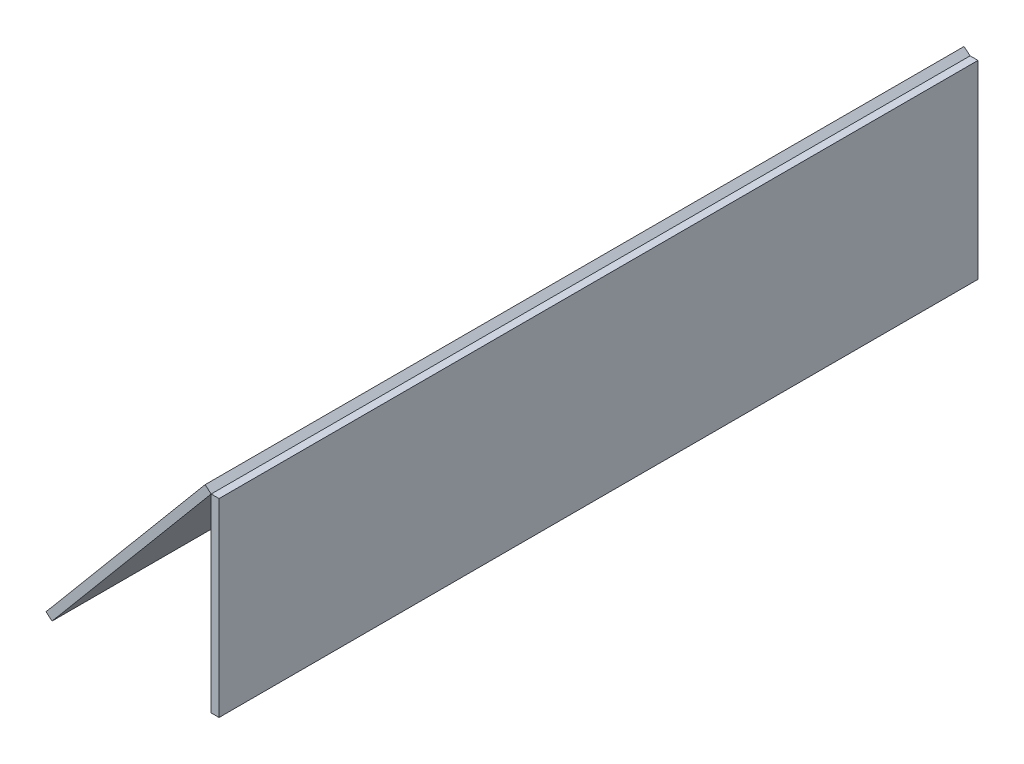
ISO-10303-21;
HEADER;
FILE_DESCRIPTION(('STEP AP214'),'2;1');
FILE_NAME('part.step','',(''),(''),'','','');
FILE_SCHEMA(('AUTOMOTIVE_DESIGN { 1 0 10303 214 1 1 1 1 }'));
ENDSEC;
DATA;
#1=APPLICATION_CONTEXT('core data for automotive mechanical design processes');
#2=APPLICATION_PROTOCOL_DEFINITION('international standard','automotive_design',2000,#1);
#3=PRODUCT_CONTEXT('',#1,'mechanical');
#4=PRODUCT('Part','Part','',(#3));
#5=PRODUCT_RELATED_PRODUCT_CATEGORY('part','',(#4));
#6=PRODUCT_DEFINITION_FORMATION('','',#4);
#7=PRODUCT_DEFINITION_CONTEXT('part definition',#1,'design');
#8=PRODUCT_DEFINITION('design','',#6,#7);
#9=PRODUCT_DEFINITION_SHAPE('','',#8);
#10=(LENGTH_UNIT() NAMED_UNIT(*) SI_UNIT(.MILLI.,.METRE.));
#11=(NAMED_UNIT(*) PLANE_ANGLE_UNIT() SI_UNIT($,.RADIAN.));
#12=(NAMED_UNIT(*) SI_UNIT($,.STERADIAN.) SOLID_ANGLE_UNIT());
#13=UNCERTAINTY_MEASURE_WITH_UNIT(LENGTH_MEASURE(1.E-05),#10,'distance_accuracy_value','');
#14=(GEOMETRIC_REPRESENTATION_CONTEXT(3) GLOBAL_UNCERTAINTY_ASSIGNED_CONTEXT((#13)) GLOBAL_UNIT_ASSIGNED_CONTEXT((#10,
#11,#12)) REPRESENTATION_CONTEXT('',''));
#15=CARTESIAN_POINT('',(0.,0.,0.));
#16=DIRECTION('',(0.,0.,1.));
#17=DIRECTION('',(1.,0.,0.));
#18=AXIS2_PLACEMENT_3D('',#15,#16,#17);
#19=CARTESIAN_POINT('',(-4.86438221380546,80.2817013215095,510.200562790563));
#20=DIRECTION('',(0.642787609686535,0.766044443118982,0.));
#21=DIRECTION('',(-0.766044443118982,0.642787609686535,0.));
#22=AXIS2_PLACEMENT_3D('',#19,#20,#21);
#23=PLANE('',#22);
#24=DIRECTION('',(-0.766044443118982,0.642787609686535,0.));
#25=VECTOR('',#24,1.);
#26=CARTESIAN_POINT('',(-4.86438221380546,80.2817013215095,305.));
#27=LINE('',#26,#25);
#28=CARTESIAN_POINT('',(0.,76.2,305.));
#29=VERTEX_POINT('',#28);
#30=CARTESIAN_POINT('',(-4.86438221380545,80.2817013215095,305.));
#31=VERTEX_POINT('',#30);
#32=EDGE_CURVE('E52',#29,#31,#27,.T.);
#33=ORIENTED_EDGE('',*,*,#32,.F.);
#34=DIRECTION('',(0.,0.,-1.));
#35=VECTOR('',#34,1.);
#36=CARTESIAN_POINT('',(0.,76.2,510.200562790563));
#37=LINE('',#36,#35);
#38=CARTESIAN_POINT('',(0.,76.2,-305.));
#39=VERTEX_POINT('',#38);
#40=EDGE_CURVE('E80',#29,#39,#37,.T.);
#41=ORIENTED_EDGE('',*,*,#40,.T.);
#42=DIRECTION('',(0.766044443118982,-0.642787609686535,0.));
#43=VECTOR('',#42,1.);
#44=CARTESIAN_POINT('',(-4.86438221380546,80.2817013215095,-305.));
#45=LINE('',#44,#43);
#46=CARTESIAN_POINT('',(-4.86438221380546,80.2817013215095,-305.));
#47=VERTEX_POINT('',#46);
#48=EDGE_CURVE('E84',#47,#39,#45,.T.);
#49=ORIENTED_EDGE('',*,*,#48,.F.);
#50=DIRECTION('',(0.,0.,-1.));
#51=VECTOR('',#50,1.);
#52=CARTESIAN_POINT('',(-4.86438221380546,80.2817013215095,510.200562790563));
#53=LINE('',#52,#51);
#54=EDGE_CURVE('E107',#31,#47,#53,.T.);
#55=ORIENTED_EDGE('',*,*,#54,.F.);
#56=EDGE_LOOP('',(#33,#41,#49,#55));
#57=FACE_BOUND('',#56,.T.);
#58=ADVANCED_FACE('F44',(#57),#23,.T.);
#59=CARTESIAN_POINT('',(-132.743166005222,-72.1182986784905,510.200562790563));
#60=DIRECTION('',(-0.766044443118981,0.642787609686536,0.));
#61=DIRECTION('',(-0.642787609686536,-0.766044443118981,0.));
#62=AXIS2_PLACEMENT_3D('',#59,#60,#61);
#63=PLANE('',#62);
#64=DIRECTION('',(-0.642787609686536,-0.766044443118981,0.));
#65=VECTOR('',#64,1.);
#66=CARTESIAN_POINT('',(-132.743166005222,-72.1182986784905,305.));
#67=LINE('',#66,#65);
#68=CARTESIAN_POINT('',(-132.743166005222,-72.1182986784905,305.));
#69=VERTEX_POINT('',#68);
#70=EDGE_CURVE('E58',#31,#69,#67,.T.);
#71=ORIENTED_EDGE('',*,*,#70,.F.);
#72=ORIENTED_EDGE('',*,*,#54,.T.);
#73=DIRECTION('',(0.642787609686536,0.766044443118981,0.));
#74=VECTOR('',#73,1.);
#75=CARTESIAN_POINT('',(-132.743166005222,-72.1182986784905,-305.));
#76=LINE('',#75,#74);
#77=CARTESIAN_POINT('',(-132.743166005222,-72.1182986784905,-305.));
#78=VERTEX_POINT('',#77);
#79=EDGE_CURVE('E89',#78,#47,#76,.T.);
#80=ORIENTED_EDGE('',*,*,#79,.F.);
#81=DIRECTION('',(0.,0.,-1.));
#82=VECTOR('',#81,1.);
#83=CARTESIAN_POINT('',(-132.743166005222,-72.1182986784905,510.200562790563));
#84=LINE('',#83,#82);
#85=EDGE_CURVE('E110',#69,#78,#84,.T.);
#86=ORIENTED_EDGE('',*,*,#85,.F.);
#87=EDGE_LOOP('',(#71,#72,#80,#86));
#88=FACE_BOUND('',#87,.T.);
#89=ADVANCED_FACE('F116',(#88),#63,.T.);
#90=CARTESIAN_POINT('',(-127.878783791416,-76.2,510.200562790563));
#91=DIRECTION('',(-0.642787609686536,-0.766044443118981,0.));
#92=DIRECTION('',(0.766044443118981,-0.642787609686536,0.));
#93=AXIS2_PLACEMENT_3D('',#90,#91,#92);
#94=PLANE('',#93);
#95=DIRECTION('',(0.766044443118981,-0.642787609686536,0.));
#96=VECTOR('',#95,1.);
#97=CARTESIAN_POINT('',(-127.878783791416,-76.2,305.));
#98=LINE('',#97,#96);
#99=CARTESIAN_POINT('',(-127.878783791416,-76.2,305.));
#100=VERTEX_POINT('',#99);
#101=EDGE_CURVE('E109',#69,#100,#98,.T.);
#102=ORIENTED_EDGE('',*,*,#101,.F.);
#103=ORIENTED_EDGE('',*,*,#85,.T.);
#104=DIRECTION('',(-0.766044443118981,0.642787609686536,0.));
#105=VECTOR('',#104,1.);
#106=CARTESIAN_POINT('',(-127.878783791416,-76.2,-305.));
#107=LINE('',#106,#105);
#108=CARTESIAN_POINT('',(-127.878783791416,-76.2,-305.));
#109=VERTEX_POINT('',#108);
#110=EDGE_CURVE('E97',#109,#78,#107,.T.);
#111=ORIENTED_EDGE('',*,*,#110,.F.);
#112=DIRECTION('',(0.,0.,-1.));
#113=VECTOR('',#112,1.);
#114=CARTESIAN_POINT('',(-127.878783791416,-76.2,510.200562790563));
#115=LINE('',#114,#113);
#116=EDGE_CURVE('E88',#100,#109,#115,.T.);
#117=ORIENTED_EDGE('',*,*,#116,.F.);
#118=EDGE_LOOP('',(#102,#103,#111,#117));
#119=FACE_BOUND('',#118,.T.);
#120=ADVANCED_FACE('F114',(#119),#94,.T.);
#121=CARTESIAN_POINT('',(0.,76.2,510.200562790563));
#122=DIRECTION('',(0.766044443118982,-0.642787609686535,0.));
#123=DIRECTION('',(0.642787609686535,0.766044443118982,0.));
#124=AXIS2_PLACEMENT_3D('',#121,#122,#123);
#125=PLANE('',#124);
#126=DIRECTION('',(0.642787609686535,0.766044443118982,0.));
#127=VECTOR('',#126,1.);
#128=CARTESIAN_POINT('',(0.,76.2,305.));
#129=LINE('',#128,#127);
#130=EDGE_CURVE('E12',#100,#29,#129,.T.);
#131=ORIENTED_EDGE('',*,*,#130,.F.);
#132=ORIENTED_EDGE('',*,*,#116,.T.);
#133=DIRECTION('',(-0.642787609686535,-0.766044443118982,0.));
#134=VECTOR('',#133,1.);
#135=CARTESIAN_POINT('',(0.,76.2,-305.));
#136=LINE('',#135,#134);
#137=EDGE_CURVE('E91',#39,#109,#136,.T.);
#138=ORIENTED_EDGE('',*,*,#137,.F.);
#139=ORIENTED_EDGE('',*,*,#40,.F.);
#140=EDGE_LOOP('',(#131,#132,#138,#139));
#141=FACE_BOUND('',#140,.T.);
#142=ADVANCED_FACE('F92',(#141),#125,.T.);
#143=CARTESIAN_POINT('',(0.,0.,-305.));
#144=DIRECTION('',(0.,0.,-1.));
#145=DIRECTION('',(-1.,0.,0.));
#146=AXIS2_PLACEMENT_3D('',#143,#144,#145);
#147=PLANE('',#146);
#148=ORIENTED_EDGE('',*,*,#48,.T.);
#149=ORIENTED_EDGE('',*,*,#137,.T.);
#150=ORIENTED_EDGE('',*,*,#110,.T.);
#151=ORIENTED_EDGE('',*,*,#79,.T.);
#152=EDGE_LOOP('',(#148,#149,#150,#151));
#153=FACE_BOUND('',#152,.T.);
#154=ADVANCED_FACE('F99',(#153),#147,.T.);
#155=CARTESIAN_POINT('',(6.35,-76.2,305.));
#156=DIRECTION('',(0.,0.,-1.));
#157=DIRECTION('',(-1.,0.,0.));
#158=AXIS2_PLACEMENT_3D('',#155,#156,#157);
#159=PLANE('',#158);
#160=ORIENTED_EDGE('',*,*,#32,.T.);
#161=ORIENTED_EDGE('',*,*,#70,.T.);
#162=ORIENTED_EDGE('',*,*,#101,.T.);
#163=ORIENTED_EDGE('',*,*,#130,.T.);
#164=EDGE_LOOP('',(#160,#161,#162,#163));
#165=FACE_BOUND('',#164,.T.);
#166=ADVANCED_FACE('F118',(#165),#159,.F.);
#167=CLOSED_SHELL('',(#58,#89,#120,#142,#154,#166));
#168=MANIFOLD_SOLID_BREP('B2',#167);
#169=CARTESIAN_POINT('',(6.35,-76.2,-305.));
#170=DIRECTION('',(0.,0.,1.));
#171=DIRECTION('',(1.,0.,0.));
#172=AXIS2_PLACEMENT_3D('',#169,#170,#171);
#173=PLANE('',#172);
#174=DIRECTION('',(0.,1.,0.));
#175=VECTOR('',#174,1.);
#176=CARTESIAN_POINT('',(0.,-76.2,-305.));
#177=LINE('',#176,#175);
#178=CARTESIAN_POINT('',(0.,-76.2,-305.));
#179=VERTEX_POINT('',#178);
#180=CARTESIAN_POINT('',(0.,76.2,-305.));
#181=VERTEX_POINT('',#180);
#182=EDGE_CURVE('E230',#179,#181,#177,.T.);
#183=ORIENTED_EDGE('',*,*,#182,.T.);
#184=DIRECTION('',(-1.,0.,0.));
#185=VECTOR('',#184,1.);
#186=CARTESIAN_POINT('',(6.35,76.2,-305.));
#187=LINE('',#186,#185);
#188=CARTESIAN_POINT('',(6.35,76.2,-305.));
#189=VERTEX_POINT('',#188);
#190=EDGE_CURVE('E42',#189,#181,#187,.T.);
#191=ORIENTED_EDGE('',*,*,#190,.F.);
#192=DIRECTION('',(0.,1.,0.));
#193=VECTOR('',#192,1.);
#194=CARTESIAN_POINT('',(6.35,-76.2,-305.));
#195=LINE('',#194,#193);
#196=CARTESIAN_POINT('',(6.35,-76.2,-305.));
#197=VERTEX_POINT('',#196);
#198=EDGE_CURVE('E218',#197,#189,#195,.T.);
#199=ORIENTED_EDGE('',*,*,#198,.F.);
#200=DIRECTION('',(-1.,0.,0.));
#201=VECTOR('',#200,1.);
#202=CARTESIAN_POINT('',(6.35,-76.2,-305.));
#203=LINE('',#202,#201);
#204=EDGE_CURVE('E226',#197,#179,#203,.T.);
#205=ORIENTED_EDGE('',*,*,#204,.T.);
#206=EDGE_LOOP('',(#183,#191,#199,#205));
#207=FACE_BOUND('',#206,.T.);
#208=ADVANCED_FACE('F167',(#207),#173,.F.);
#209=CARTESIAN_POINT('',(6.35,76.2,305.));
#210=DIRECTION('',(0.,-1.,0.));
#211=DIRECTION('',(0.,0.,-1.));
#212=AXIS2_PLACEMENT_3D('',#209,#210,#211);
#213=PLANE('',#212);
#214=DIRECTION('',(0.,0.,1.));
#215=VECTOR('',#214,1.);
#216=CARTESIAN_POINT('',(0.,76.2,305.));
#217=LINE('',#216,#215);
#218=CARTESIAN_POINT('',(0.,76.2,305.));
#219=VERTEX_POINT('',#218);
#220=EDGE_CURVE('E222',#181,#219,#217,.T.);
#221=ORIENTED_EDGE('',*,*,#220,.T.);
#222=DIRECTION('',(-1.,0.,0.));
#223=VECTOR('',#222,1.);
#224=CARTESIAN_POINT('',(6.35,76.2,305.));
#225=LINE('',#224,#223);
#226=CARTESIAN_POINT('',(6.35,76.2,305.));
#227=VERTEX_POINT('',#226);
#228=EDGE_CURVE('E175',#227,#219,#225,.T.);
#229=ORIENTED_EDGE('',*,*,#228,.F.);
#230=DIRECTION('',(0.,0.,1.));
#231=VECTOR('',#230,1.);
#232=CARTESIAN_POINT('',(6.35,76.2,305.));
#233=LINE('',#232,#231);
#234=EDGE_CURVE('E213',#189,#227,#233,.T.);
#235=ORIENTED_EDGE('',*,*,#234,.F.);
#236=ORIENTED_EDGE('',*,*,#190,.T.);
#237=EDGE_LOOP('',(#221,#229,#235,#236));
#238=FACE_BOUND('',#237,.T.);
#239=ADVANCED_FACE('F221',(#238),#213,.F.);
#240=CARTESIAN_POINT('',(6.35,-76.2,305.));
#241=DIRECTION('',(0.,0.,-1.));
#242=DIRECTION('',(-1.,0.,0.));
#243=AXIS2_PLACEMENT_3D('',#240,#241,#242);
#244=PLANE('',#243);
#245=DIRECTION('',(0.,-1.,0.));
#246=VECTOR('',#245,1.);
#247=CARTESIAN_POINT('',(0.,-76.2,305.));
#248=LINE('',#247,#246);
#249=CARTESIAN_POINT('',(0.,-76.2,305.));
#250=VERTEX_POINT('',#249);
#251=EDGE_CURVE('E200',#219,#250,#248,.T.);
#252=ORIENTED_EDGE('',*,*,#251,.T.);
#253=DIRECTION('',(-1.,0.,0.));
#254=VECTOR('',#253,1.);
#255=CARTESIAN_POINT('',(6.35,-76.2,305.));
#256=LINE('',#255,#254);
#257=CARTESIAN_POINT('',(6.35,-76.2,305.));
#258=VERTEX_POINT('',#257);
#259=EDGE_CURVE('E223',#258,#250,#256,.T.);
#260=ORIENTED_EDGE('',*,*,#259,.F.);
#261=DIRECTION('',(0.,-1.,0.));
#262=VECTOR('',#261,1.);
#263=CARTESIAN_POINT('',(6.35,-76.2,305.));
#264=LINE('',#263,#262);
#265=EDGE_CURVE('E216',#227,#258,#264,.T.);
#266=ORIENTED_EDGE('',*,*,#265,.F.);
#267=ORIENTED_EDGE('',*,*,#228,.T.);
#268=EDGE_LOOP('',(#252,#260,#266,#267));
#269=FACE_BOUND('',#268,.T.);
#270=ADVANCED_FACE('F224',(#269),#244,.F.);
#271=CARTESIAN_POINT('',(6.35,-76.2,305.));
#272=DIRECTION('',(0.,1.,0.));
#273=DIRECTION('',(0.,0.,1.));
#274=AXIS2_PLACEMENT_3D('',#271,#272,#273);
#275=PLANE('',#274);
#276=DIRECTION('',(0.,0.,-1.));
#277=VECTOR('',#276,1.);
#278=CARTESIAN_POINT('',(0.,-76.2,305.));
#279=LINE('',#278,#277);
#280=EDGE_CURVE('E206',#250,#179,#279,.T.);
#281=ORIENTED_EDGE('',*,*,#280,.T.);
#282=ORIENTED_EDGE('',*,*,#204,.F.);
#283=DIRECTION('',(0.,0.,-1.));
#284=VECTOR('',#283,1.);
#285=CARTESIAN_POINT('',(6.35,-76.2,305.));
#286=LINE('',#285,#284);
#287=EDGE_CURVE('E183',#258,#197,#286,.T.);
#288=ORIENTED_EDGE('',*,*,#287,.F.);
#289=ORIENTED_EDGE('',*,*,#259,.T.);
#290=EDGE_LOOP('',(#281,#282,#288,#289));
#291=FACE_BOUND('',#290,.T.);
#292=ADVANCED_FACE('F237',(#291),#275,.F.);
#293=CARTESIAN_POINT('',(6.35,0.,0.));
#294=DIRECTION('',(-1.,0.,0.));
#295=DIRECTION('',(0.,0.,1.));
#296=AXIS2_PLACEMENT_3D('',#293,#294,#295);
#297=PLANE('',#296);
#298=ORIENTED_EDGE('',*,*,#198,.T.);
#299=ORIENTED_EDGE('',*,*,#234,.T.);
#300=ORIENTED_EDGE('',*,*,#265,.T.);
#301=ORIENTED_EDGE('',*,*,#287,.T.);
#302=EDGE_LOOP('',(#298,#299,#300,#301));
#303=FACE_BOUND('',#302,.T.);
#304=ADVANCED_FACE('F214',(#303),#297,.F.);
#305=CARTESIAN_POINT('',(0.,0.,0.));
#306=DIRECTION('',(-1.,0.,0.));
#307=DIRECTION('',(0.,0.,1.));
#308=AXIS2_PLACEMENT_3D('',#305,#306,#307);
#309=PLANE('',#308);
#310=ORIENTED_EDGE('',*,*,#182,.F.);
#311=ORIENTED_EDGE('',*,*,#280,.F.);
#312=ORIENTED_EDGE('',*,*,#251,.F.);
#313=ORIENTED_EDGE('',*,*,#220,.F.);
#314=EDGE_LOOP('',(#310,#311,#312,#313));
#315=FACE_BOUND('',#314,.T.);
#316=ADVANCED_FACE('F240',(#315),#309,.T.);
#317=CLOSED_SHELL('',(#208,#239,#270,#292,#304,#316));
#318=MANIFOLD_SOLID_BREP('B6',#317);
#319=ADVANCED_BREP_SHAPE_REPRESENTATION('',(#18,#168,#318),#14);
#320=SHAPE_DEFINITION_REPRESENTATION(#9,#319);
ENDSEC;
END-ISO-10303-21;
